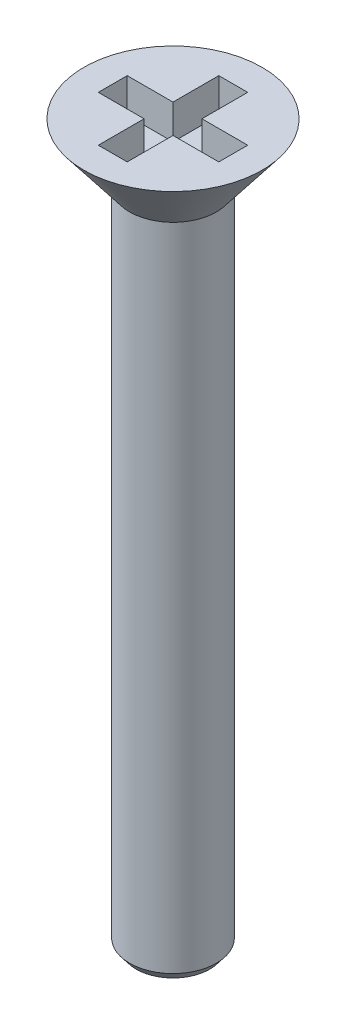
ISO-10303-21;
HEADER;
FILE_DESCRIPTION(('STEP AP214'),'2;1');
FILE_NAME('part.step','',(''),(''),'','','');
FILE_SCHEMA(('AUTOMOTIVE_DESIGN { 1 0 10303 214 1 1 1 1 }'));
ENDSEC;
DATA;
#1=APPLICATION_CONTEXT('core data for automotive mechanical design processes');
#2=APPLICATION_PROTOCOL_DEFINITION('international standard','automotive_design',2000,#1);
#3=PRODUCT_CONTEXT('',#1,'mechanical');
#4=PRODUCT('Part','Part','',(#3));
#5=PRODUCT_RELATED_PRODUCT_CATEGORY('part','',(#4));
#6=PRODUCT_DEFINITION_FORMATION('','',#4);
#7=PRODUCT_DEFINITION_CONTEXT('part definition',#1,'design');
#8=PRODUCT_DEFINITION('design','',#6,#7);
#9=PRODUCT_DEFINITION_SHAPE('','',#8);
#10=(LENGTH_UNIT() NAMED_UNIT(*) SI_UNIT(.MILLI.,.METRE.));
#11=(NAMED_UNIT(*) PLANE_ANGLE_UNIT() SI_UNIT($,.RADIAN.));
#12=(NAMED_UNIT(*) SI_UNIT($,.STERADIAN.) SOLID_ANGLE_UNIT());
#13=UNCERTAINTY_MEASURE_WITH_UNIT(LENGTH_MEASURE(1.E-05),#10,'distance_accuracy_value','');
#14=(GEOMETRIC_REPRESENTATION_CONTEXT(3) GLOBAL_UNCERTAINTY_ASSIGNED_CONTEXT((#13)) GLOBAL_UNIT_ASSIGNED_CONTEXT((#10,
#11,#12)) REPRESENTATION_CONTEXT('',''));
#15=CARTESIAN_POINT('',(0.,0.,0.));
#16=DIRECTION('',(0.,0.,1.));
#17=DIRECTION('',(1.,0.,0.));
#18=AXIS2_PLACEMENT_3D('',#15,#16,#17);
#19=CARTESIAN_POINT('',(0.,11.7896796485183,0.));
#20=DIRECTION('',(0.,1.,0.));
#21=DIRECTION('',(0.,0.,1.));
#22=AXIS2_PLACEMENT_3D('',#19,#20,#21);
#23=PLANE('',#22);
#24=CARTESIAN_POINT('',(0.,11.7896796485183,0.));
#25=DIRECTION('',(0.,1.,0.));
#26=DIRECTION('',(0.,0.,1.));
#27=AXIS2_PLACEMENT_3D('',#24,#25,#26);
#28=CIRCLE('',#27,3.7);
#29=CARTESIAN_POINT('',(0.,11.7896796485183,3.7));
#30=VERTEX_POINT('',#29);
#31=EDGE_CURVE('E11',#30,#30,#28,.T.);
#32=ORIENTED_EDGE('',*,*,#31,.T.);
#33=EDGE_LOOP('',(#32));
#34=FACE_BOUND('',#33,.T.);
#35=DIRECTION('',(0.,0.,-1.));
#36=VECTOR('',#35,1.);
#37=CARTESIAN_POINT('',(2.5,11.7896796485183,0.));
#38=LINE('',#37,#36);
#39=CARTESIAN_POINT('',(2.5,11.7896796485183,0.600000000000009));
#40=VERTEX_POINT('',#39);
#41=CARTESIAN_POINT('',(2.5,11.7896796485183,-0.599999999999991));
#42=VERTEX_POINT('',#41);
#43=EDGE_CURVE('E156',#40,#42,#38,.T.);
#44=ORIENTED_EDGE('',*,*,#43,.F.);
#45=DIRECTION('',(-1.,0.,0.));
#46=VECTOR('',#45,1.);
#47=CARTESIAN_POINT('',(0.,11.7896796485183,0.6));
#48=LINE('',#47,#46);
#49=CARTESIAN_POINT('',(0.6,11.7896796485183,0.600000000000006));
#50=VERTEX_POINT('',#49);
#51=EDGE_CURVE('E47',#40,#50,#48,.T.);
#52=ORIENTED_EDGE('',*,*,#51,.T.);
#53=DIRECTION('',(0.,0.,-1.));
#54=VECTOR('',#53,1.);
#55=CARTESIAN_POINT('',(0.6,11.7896796485183,0.));
#56=LINE('',#55,#54);
#57=CARTESIAN_POINT('',(0.6,11.7896796485183,2.5));
#58=VERTEX_POINT('',#57);
#59=EDGE_CURVE('E183',#58,#50,#56,.T.);
#60=ORIENTED_EDGE('',*,*,#59,.F.);
#61=DIRECTION('',(-1.,0.,0.));
#62=VECTOR('',#61,1.);
#63=CARTESIAN_POINT('',(0.,11.7896796485183,2.5));
#64=LINE('',#63,#62);
#65=CARTESIAN_POINT('',(-0.6,11.7896796485183,2.5));
#66=VERTEX_POINT('',#65);
#67=EDGE_CURVE('E181',#58,#66,#64,.T.);
#68=ORIENTED_EDGE('',*,*,#67,.T.);
#69=DIRECTION('',(0.,0.,-1.));
#70=VECTOR('',#69,1.);
#71=CARTESIAN_POINT('',(-0.600000000000005,11.7896796485183,0.));
#72=LINE('',#71,#70);
#73=CARTESIAN_POINT('',(-0.600000000000004,11.7896796485183,0.599999999999998));
#74=VERTEX_POINT('',#73);
#75=EDGE_CURVE('E140',#66,#74,#72,.T.);
#76=ORIENTED_EDGE('',*,*,#75,.T.);
#77=DIRECTION('',(1.,0.,0.));
#78=VECTOR('',#77,1.);
#79=CARTESIAN_POINT('',(0.,11.7896796485183,0.6));
#80=LINE('',#79,#78);
#81=CARTESIAN_POINT('',(-2.5,11.7896796485183,0.599999999999991));
#82=VERTEX_POINT('',#81);
#83=EDGE_CURVE('E177',#82,#74,#80,.T.);
#84=ORIENTED_EDGE('',*,*,#83,.F.);
#85=DIRECTION('',(0.,0.,-1.));
#86=VECTOR('',#85,1.);
#87=CARTESIAN_POINT('',(-2.5,11.7896796485183,0.));
#88=LINE('',#87,#86);
#89=CARTESIAN_POINT('',(-2.5,11.7896796485183,-0.600000000000009));
#90=VERTEX_POINT('',#89);
#91=EDGE_CURVE('E174',#82,#90,#88,.T.);
#92=ORIENTED_EDGE('',*,*,#91,.T.);
#93=DIRECTION('',(1.,0.,0.));
#94=VECTOR('',#93,1.);
#95=CARTESIAN_POINT('',(0.,11.7896796485183,-0.600000000000006));
#96=LINE('',#95,#94);
#97=CARTESIAN_POINT('',(-0.6,11.7896796485183,-0.600000000000006));
#98=VERTEX_POINT('',#97);
#99=EDGE_CURVE('E171',#90,#98,#96,.T.);
#100=ORIENTED_EDGE('',*,*,#99,.T.);
#101=DIRECTION('',(0.,0.,1.));
#102=VECTOR('',#101,1.);
#103=CARTESIAN_POINT('',(-0.600000000000006,11.7896796485183,0.));
#104=LINE('',#103,#102);
#105=CARTESIAN_POINT('',(-0.6,11.7896796485183,-2.5));
#106=VERTEX_POINT('',#105);
#107=EDGE_CURVE('E168',#106,#98,#104,.T.);
#108=ORIENTED_EDGE('',*,*,#107,.F.);
#109=DIRECTION('',(-1.,0.,0.));
#110=VECTOR('',#109,1.);
#111=CARTESIAN_POINT('',(0.,11.7896796485183,-2.5));
#112=LINE('',#111,#110);
#113=CARTESIAN_POINT('',(0.6,11.7896796485183,-2.5));
#114=VERTEX_POINT('',#113);
#115=EDGE_CURVE('E165',#114,#106,#112,.T.);
#116=ORIENTED_EDGE('',*,*,#115,.F.);
#117=DIRECTION('',(0.,0.,1.));
#118=VECTOR('',#117,1.);
#119=CARTESIAN_POINT('',(0.6,11.7896796485183,0.));
#120=LINE('',#119,#118);
#121=CARTESIAN_POINT('',(0.600000000000004,11.7896796485183,-0.599999999999998));
#122=VERTEX_POINT('',#121);
#123=EDGE_CURVE('E162',#114,#122,#120,.T.);
#124=ORIENTED_EDGE('',*,*,#123,.T.);
#125=DIRECTION('',(-1.,0.,0.));
#126=VECTOR('',#125,1.);
#127=CARTESIAN_POINT('',(0.,11.7896796485183,-0.600000000000006));
#128=LINE('',#127,#126);
#129=EDGE_CURVE('E159',#42,#122,#128,.T.);
#130=ORIENTED_EDGE('',*,*,#129,.F.);
#131=EDGE_LOOP('',(#44,#52,#60,#68,#76,#84,#92,#100,#108,#116,#124,#130));
#132=FACE_BOUND('',#131,.T.);
#133=ADVANCED_FACE('F33',(#34,#132),#23,.T.);
#134=CARTESIAN_POINT('',(0.,11.7896796485183,0.));
#135=DIRECTION('',(0.,1.,0.));
#136=DIRECTION('',(0.,0.,1.));
#137=AXIS2_PLACEMENT_3D('',#134,#135,#136);
#138=CONICAL_SURFACE('',#137,3.7,0.659628742636921);
#139=CARTESIAN_POINT('',(0.,9.33967964851831,0.));
#140=DIRECTION('',(0.,1.,0.));
#141=DIRECTION('',(0.,0.,1.));
#142=AXIS2_PLACEMENT_3D('',#139,#140,#141);
#143=CIRCLE('',#142,1.8);
#144=CARTESIAN_POINT('',(0.,9.33967964851831,1.8));
#145=VERTEX_POINT('',#144);
#146=EDGE_CURVE('E40',#145,#145,#143,.T.);
#147=ORIENTED_EDGE('',*,*,#146,.T.);
#148=EDGE_LOOP('',(#147));
#149=FACE_BOUND('',#148,.T.);
#150=ORIENTED_EDGE('',*,*,#31,.F.);
#151=EDGE_LOOP('',(#150));
#152=FACE_BOUND('',#151,.T.);
#153=ADVANCED_FACE('F211',(#149,#152),#138,.T.);
#154=CARTESIAN_POINT('',(0.,14.4405151022248,0.));
#155=DIRECTION('',(0.,1.,0.));
#156=DIRECTION('',(0.,0.,1.));
#157=AXIS2_PLACEMENT_3D('',#154,#155,#156);
#158=CYLINDRICAL_SURFACE('',#157,1.8);
#159=CARTESIAN_POINT('',(0.,-17.6603203514817,0.));
#160=DIRECTION('',(0.,1.,0.));
#161=DIRECTION('',(0.,0.,1.));
#162=AXIS2_PLACEMENT_3D('',#159,#160,#161);
#163=CIRCLE('',#162,1.8);
#164=CARTESIAN_POINT('',(0.,-17.6603203514817,1.8));
#165=VERTEX_POINT('',#164);
#166=EDGE_CURVE('E206',#165,#165,#163,.T.);
#167=ORIENTED_EDGE('',*,*,#166,.T.);
#168=EDGE_LOOP('',(#167));
#169=FACE_BOUND('',#168,.T.);
#170=ORIENTED_EDGE('',*,*,#146,.F.);
#171=EDGE_LOOP('',(#170));
#172=FACE_BOUND('',#171,.T.);
#173=ADVANCED_FACE('F214',(#169,#172),#158,.T.);
#174=CARTESIAN_POINT('',(0.,-17.6603203514817,0.));
#175=DIRECTION('',(0.,1.,0.));
#176=DIRECTION('',(0.,0.,1.));
#177=AXIS2_PLACEMENT_3D('',#174,#175,#176);
#178=CONICAL_SURFACE('',#177,1.8,0.65962874263692);
#179=CARTESIAN_POINT('',(0.,-18.0103203514817,0.));
#180=DIRECTION('',(0.,1.,0.));
#181=DIRECTION('',(0.,0.,1.));
#182=AXIS2_PLACEMENT_3D('',#179,#180,#181);
#183=CIRCLE('',#182,1.52857142857142);
#184=CARTESIAN_POINT('',(0.,-18.0103203514817,1.52857142857142));
#185=VERTEX_POINT('',#184);
#186=EDGE_CURVE('E186',#185,#185,#183,.T.);
#187=ORIENTED_EDGE('',*,*,#186,.T.);
#188=EDGE_LOOP('',(#187));
#189=FACE_BOUND('',#188,.T.);
#190=ORIENTED_EDGE('',*,*,#166,.F.);
#191=EDGE_LOOP('',(#190));
#192=FACE_BOUND('',#191,.T.);
#193=ADVANCED_FACE('F216',(#189,#192),#178,.T.);
#194=CARTESIAN_POINT('',(0.,-18.0103203514817,1.52857142857142));
#195=DIRECTION('',(0.,-1.,0.));
#196=DIRECTION('',(0.,0.,-1.));
#197=AXIS2_PLACEMENT_3D('',#194,#195,#196);
#198=PLANE('',#197);
#199=ORIENTED_EDGE('',*,*,#186,.F.);
#200=EDGE_LOOP('',(#199));
#201=FACE_BOUND('',#200,.T.);
#202=ADVANCED_FACE('F223',(#201),#198,.T.);
#203=CARTESIAN_POINT('',(0.,10.3596796485183,0.6));
#204=DIRECTION('',(0.,0.,-1.));
#205=DIRECTION('',(-1.,0.,0.));
#206=AXIS2_PLACEMENT_3D('',#203,#204,#205);
#207=PLANE('',#206);
#208=ORIENTED_EDGE('',*,*,#51,.F.);
#209=DIRECTION('',(0.,1.,0.));
#210=VECTOR('',#209,1.);
#211=CARTESIAN_POINT('',(2.5,10.3596796485183,0.600000000000009));
#212=LINE('',#211,#210);
#213=CARTESIAN_POINT('',(2.5,10.3596796485183,0.600000000000009));
#214=VERTEX_POINT('',#213);
#215=EDGE_CURVE('E95',#214,#40,#212,.T.);
#216=ORIENTED_EDGE('',*,*,#215,.F.);
#217=DIRECTION('',(-1.,0.,0.));
#218=VECTOR('',#217,1.);
#219=CARTESIAN_POINT('',(0.,10.3596796485183,0.6));
#220=LINE('',#219,#218);
#221=CARTESIAN_POINT('',(0.6,10.3596796485183,0.600000000000006));
#222=VERTEX_POINT('',#221);
#223=EDGE_CURVE('E53',#214,#222,#220,.T.);
#224=ORIENTED_EDGE('',*,*,#223,.T.);
#225=DIRECTION('',(0.,1.,0.));
#226=VECTOR('',#225,1.);
#227=CARTESIAN_POINT('',(0.6,10.3596796485183,0.600000000000006));
#228=LINE('',#227,#226);
#229=EDGE_CURVE('E91',#222,#50,#228,.T.);
#230=ORIENTED_EDGE('',*,*,#229,.T.);
#231=EDGE_LOOP('',(#208,#216,#224,#230));
#232=FACE_BOUND('',#231,.T.);
#233=ADVANCED_FACE('F303',(#232),#207,.T.);
#234=CARTESIAN_POINT('',(0.6,10.3596796485183,0.));
#235=DIRECTION('',(1.,0.,0.));
#236=DIRECTION('',(0.,0.,-1.));
#237=AXIS2_PLACEMENT_3D('',#234,#235,#236);
#238=PLANE('',#237);
#239=ORIENTED_EDGE('',*,*,#59,.T.);
#240=ORIENTED_EDGE('',*,*,#229,.F.);
#241=DIRECTION('',(0.,0.,-1.));
#242=VECTOR('',#241,1.);
#243=CARTESIAN_POINT('',(0.6,10.3596796485183,0.));
#244=LINE('',#243,#242);
#245=CARTESIAN_POINT('',(0.6,10.3596796485183,2.5));
#246=VERTEX_POINT('',#245);
#247=EDGE_CURVE('E133',#246,#222,#244,.T.);
#248=ORIENTED_EDGE('',*,*,#247,.F.);
#249=DIRECTION('',(0.,1.,0.));
#250=VECTOR('',#249,1.);
#251=CARTESIAN_POINT('',(0.6,10.3596796485183,2.5));
#252=LINE('',#251,#250);
#253=EDGE_CURVE('E128',#246,#58,#252,.T.);
#254=ORIENTED_EDGE('',*,*,#253,.T.);
#255=EDGE_LOOP('',(#239,#240,#248,#254));
#256=FACE_BOUND('',#255,.T.);
#257=ADVANCED_FACE('F306',(#256),#238,.F.);
#258=CARTESIAN_POINT('',(0.,10.3596796485183,2.5));
#259=DIRECTION('',(0.,0.,-1.));
#260=DIRECTION('',(-1.,0.,0.));
#261=AXIS2_PLACEMENT_3D('',#258,#259,#260);
#262=PLANE('',#261);
#263=ORIENTED_EDGE('',*,*,#67,.F.);
#264=ORIENTED_EDGE('',*,*,#253,.F.);
#265=DIRECTION('',(-1.,0.,0.));
#266=VECTOR('',#265,1.);
#267=CARTESIAN_POINT('',(0.,10.3596796485183,2.5));
#268=LINE('',#267,#266);
#269=CARTESIAN_POINT('',(-0.6,10.3596796485183,2.5));
#270=VERTEX_POINT('',#269);
#271=EDGE_CURVE('E122',#246,#270,#268,.T.);
#272=ORIENTED_EDGE('',*,*,#271,.T.);
#273=DIRECTION('',(0.,1.,0.));
#274=VECTOR('',#273,1.);
#275=CARTESIAN_POINT('',(-0.6,10.3596796485183,2.5));
#276=LINE('',#275,#274);
#277=EDGE_CURVE('E126',#270,#66,#276,.T.);
#278=ORIENTED_EDGE('',*,*,#277,.T.);
#279=EDGE_LOOP('',(#263,#264,#272,#278));
#280=FACE_BOUND('',#279,.T.);
#281=ADVANCED_FACE('F125',(#280),#262,.T.);
#282=CARTESIAN_POINT('',(-0.600000000000005,10.3596796485183,0.));
#283=DIRECTION('',(1.,0.,0.));
#284=DIRECTION('',(0.,0.,-1.));
#285=AXIS2_PLACEMENT_3D('',#282,#283,#284);
#286=PLANE('',#285);
#287=ORIENTED_EDGE('',*,*,#75,.F.);
#288=ORIENTED_EDGE('',*,*,#277,.F.);
#289=DIRECTION('',(0.,0.,-1.));
#290=VECTOR('',#289,1.);
#291=CARTESIAN_POINT('',(-0.600000000000005,10.3596796485183,0.));
#292=LINE('',#291,#290);
#293=CARTESIAN_POINT('',(-0.600000000000004,10.3596796485183,0.599999999999998));
#294=VERTEX_POINT('',#293);
#295=EDGE_CURVE('E134',#270,#294,#292,.T.);
#296=ORIENTED_EDGE('',*,*,#295,.T.);
#297=DIRECTION('',(0.,1.,0.));
#298=VECTOR('',#297,1.);
#299=CARTESIAN_POINT('',(-0.600000000000004,10.3596796485183,0.599999999999998));
#300=LINE('',#299,#298);
#301=EDGE_CURVE('E142',#294,#74,#300,.T.);
#302=ORIENTED_EDGE('',*,*,#301,.T.);
#303=EDGE_LOOP('',(#287,#288,#296,#302));
#304=FACE_BOUND('',#303,.T.);
#305=ADVANCED_FACE('F137',(#304),#286,.T.);
#306=CARTESIAN_POINT('',(0.,10.3596796485183,0.6));
#307=DIRECTION('',(0.,0.,1.));
#308=DIRECTION('',(1.,0.,0.));
#309=AXIS2_PLACEMENT_3D('',#306,#307,#308);
#310=PLANE('',#309);
#311=ORIENTED_EDGE('',*,*,#83,.T.);
#312=ORIENTED_EDGE('',*,*,#301,.F.);
#313=DIRECTION('',(1.,0.,0.));
#314=VECTOR('',#313,1.);
#315=CARTESIAN_POINT('',(0.,10.3596796485183,0.6));
#316=LINE('',#315,#314);
#317=CARTESIAN_POINT('',(-2.5,10.3596796485183,0.599999999999991));
#318=VERTEX_POINT('',#317);
#319=EDGE_CURVE('E148',#318,#294,#316,.T.);
#320=ORIENTED_EDGE('',*,*,#319,.F.);
#321=DIRECTION('',(0.,1.,0.));
#322=VECTOR('',#321,1.);
#323=CARTESIAN_POINT('',(-2.5,10.3596796485183,0.599999999999991));
#324=LINE('',#323,#322);
#325=EDGE_CURVE('E189',#318,#82,#324,.T.);
#326=ORIENTED_EDGE('',*,*,#325,.T.);
#327=EDGE_LOOP('',(#311,#312,#320,#326));
#328=FACE_BOUND('',#327,.T.);
#329=ADVANCED_FACE('F274',(#328),#310,.F.);
#330=CARTESIAN_POINT('',(-2.5,10.3596796485183,0.));
#331=DIRECTION('',(1.,0.,0.));
#332=DIRECTION('',(0.,0.,-1.));
#333=AXIS2_PLACEMENT_3D('',#330,#331,#332);
#334=PLANE('',#333);
#335=ORIENTED_EDGE('',*,*,#91,.F.);
#336=ORIENTED_EDGE('',*,*,#325,.F.);
#337=DIRECTION('',(0.,0.,-1.));
#338=VECTOR('',#337,1.);
#339=CARTESIAN_POINT('',(-2.5,10.3596796485183,0.));
#340=LINE('',#339,#338);
#341=CARTESIAN_POINT('',(-2.5,10.3596796485183,-0.600000000000009));
#342=VERTEX_POINT('',#341);
#343=EDGE_CURVE('E150',#318,#342,#340,.T.);
#344=ORIENTED_EDGE('',*,*,#343,.T.);
#345=DIRECTION('',(0.,1.,0.));
#346=VECTOR('',#345,1.);
#347=CARTESIAN_POINT('',(-2.5,10.3596796485183,-0.600000000000009));
#348=LINE('',#347,#346);
#349=EDGE_CURVE('E191',#342,#90,#348,.T.);
#350=ORIENTED_EDGE('',*,*,#349,.T.);
#351=EDGE_LOOP('',(#335,#336,#344,#350));
#352=FACE_BOUND('',#351,.T.);
#353=ADVANCED_FACE('F259',(#352),#334,.T.);
#354=CARTESIAN_POINT('',(0.,10.3596796485183,-0.600000000000006));
#355=DIRECTION('',(0.,0.,1.));
#356=DIRECTION('',(1.,0.,0.));
#357=AXIS2_PLACEMENT_3D('',#354,#355,#356);
#358=PLANE('',#357);
#359=ORIENTED_EDGE('',*,*,#99,.F.);
#360=ORIENTED_EDGE('',*,*,#349,.F.);
#361=DIRECTION('',(1.,0.,0.));
#362=VECTOR('',#361,1.);
#363=CARTESIAN_POINT('',(0.,10.3596796485183,-0.600000000000006));
#364=LINE('',#363,#362);
#365=CARTESIAN_POINT('',(-0.6,10.3596796485183,-0.600000000000006));
#366=VERTEX_POINT('',#365);
#367=EDGE_CURVE('E255',#342,#366,#364,.T.);
#368=ORIENTED_EDGE('',*,*,#367,.T.);
#369=DIRECTION('',(0.,1.,0.));
#370=VECTOR('',#369,1.);
#371=CARTESIAN_POINT('',(-0.6,10.3596796485183,-0.600000000000006));
#372=LINE('',#371,#370);
#373=EDGE_CURVE('E193',#366,#98,#372,.T.);
#374=ORIENTED_EDGE('',*,*,#373,.T.);
#375=EDGE_LOOP('',(#359,#360,#368,#374));
#376=FACE_BOUND('',#375,.T.);
#377=ADVANCED_FACE('F263',(#376),#358,.T.);
#378=CARTESIAN_POINT('',(-0.600000000000006,10.3596796485183,0.));
#379=DIRECTION('',(-1.,0.,0.));
#380=DIRECTION('',(0.,0.,1.));
#381=AXIS2_PLACEMENT_3D('',#378,#379,#380);
#382=PLANE('',#381);
#383=ORIENTED_EDGE('',*,*,#107,.T.);
#384=ORIENTED_EDGE('',*,*,#373,.F.);
#385=DIRECTION('',(0.,0.,1.));
#386=VECTOR('',#385,1.);
#387=CARTESIAN_POINT('',(-0.600000000000006,10.3596796485183,0.));
#388=LINE('',#387,#386);
#389=CARTESIAN_POINT('',(-0.6,10.3596796485183,-2.5));
#390=VERTEX_POINT('',#389);
#391=EDGE_CURVE('E252',#390,#366,#388,.T.);
#392=ORIENTED_EDGE('',*,*,#391,.F.);
#393=DIRECTION('',(0.,1.,0.));
#394=VECTOR('',#393,1.);
#395=CARTESIAN_POINT('',(-0.6,10.3596796485183,-2.5));
#396=LINE('',#395,#394);
#397=EDGE_CURVE('E195',#390,#106,#396,.T.);
#398=ORIENTED_EDGE('',*,*,#397,.T.);
#399=EDGE_LOOP('',(#383,#384,#392,#398));
#400=FACE_BOUND('',#399,.T.);
#401=ADVANCED_FACE('F269',(#400),#382,.F.);
#402=CARTESIAN_POINT('',(0.,10.3596796485183,-2.5));
#403=DIRECTION('',(0.,0.,-1.));
#404=DIRECTION('',(-1.,0.,0.));
#405=AXIS2_PLACEMENT_3D('',#402,#403,#404);
#406=PLANE('',#405);
#407=ORIENTED_EDGE('',*,*,#115,.T.);
#408=ORIENTED_EDGE('',*,*,#397,.F.);
#409=DIRECTION('',(-1.,0.,0.));
#410=VECTOR('',#409,1.);
#411=CARTESIAN_POINT('',(0.,10.3596796485183,-2.5));
#412=LINE('',#411,#410);
#413=CARTESIAN_POINT('',(0.6,10.3596796485183,-2.5));
#414=VERTEX_POINT('',#413);
#415=EDGE_CURVE('E249',#414,#390,#412,.T.);
#416=ORIENTED_EDGE('',*,*,#415,.F.);
#417=DIRECTION('',(0.,1.,0.));
#418=VECTOR('',#417,1.);
#419=CARTESIAN_POINT('',(0.6,10.3596796485183,-2.5));
#420=LINE('',#419,#418);
#421=EDGE_CURVE('E197',#414,#114,#420,.T.);
#422=ORIENTED_EDGE('',*,*,#421,.T.);
#423=EDGE_LOOP('',(#407,#408,#416,#422));
#424=FACE_BOUND('',#423,.T.);
#425=ADVANCED_FACE('F289',(#424),#406,.F.);
#426=CARTESIAN_POINT('',(0.6,10.3596796485183,0.));
#427=DIRECTION('',(-1.,0.,0.));
#428=DIRECTION('',(0.,0.,1.));
#429=AXIS2_PLACEMENT_3D('',#426,#427,#428);
#430=PLANE('',#429);
#431=ORIENTED_EDGE('',*,*,#123,.F.);
#432=ORIENTED_EDGE('',*,*,#421,.F.);
#433=DIRECTION('',(0.,0.,1.));
#434=VECTOR('',#433,1.);
#435=CARTESIAN_POINT('',(0.6,10.3596796485183,0.));
#436=LINE('',#435,#434);
#437=CARTESIAN_POINT('',(0.600000000000004,10.3596796485183,-0.599999999999998));
#438=VERTEX_POINT('',#437);
#439=EDGE_CURVE('E244',#414,#438,#436,.T.);
#440=ORIENTED_EDGE('',*,*,#439,.T.);
#441=DIRECTION('',(0.,1.,0.));
#442=VECTOR('',#441,1.);
#443=CARTESIAN_POINT('',(0.600000000000004,10.3596796485183,-0.599999999999998));
#444=LINE('',#443,#442);
#445=EDGE_CURVE('E199',#438,#122,#444,.T.);
#446=ORIENTED_EDGE('',*,*,#445,.T.);
#447=EDGE_LOOP('',(#431,#432,#440,#446));
#448=FACE_BOUND('',#447,.T.);
#449=ADVANCED_FACE('F292',(#448),#430,.T.);
#450=CARTESIAN_POINT('',(0.,10.3596796485183,-0.600000000000006));
#451=DIRECTION('',(0.,0.,-1.));
#452=DIRECTION('',(-1.,0.,0.));
#453=AXIS2_PLACEMENT_3D('',#450,#451,#452);
#454=PLANE('',#453);
#455=ORIENTED_EDGE('',*,*,#129,.T.);
#456=ORIENTED_EDGE('',*,*,#445,.F.);
#457=DIRECTION('',(-1.,0.,0.));
#458=VECTOR('',#457,1.);
#459=CARTESIAN_POINT('',(0.,10.3596796485183,-0.600000000000006));
#460=LINE('',#459,#458);
#461=CARTESIAN_POINT('',(2.5,10.3596796485183,-0.599999999999991));
#462=VERTEX_POINT('',#461);
#463=EDGE_CURVE('E242',#462,#438,#460,.T.);
#464=ORIENTED_EDGE('',*,*,#463,.F.);
#465=DIRECTION('',(0.,1.,0.));
#466=VECTOR('',#465,1.);
#467=CARTESIAN_POINT('',(2.5,10.3596796485183,-0.599999999999991));
#468=LINE('',#467,#466);
#469=EDGE_CURVE('E201',#462,#42,#468,.T.);
#470=ORIENTED_EDGE('',*,*,#469,.T.);
#471=EDGE_LOOP('',(#455,#456,#464,#470));
#472=FACE_BOUND('',#471,.T.);
#473=ADVANCED_FACE('F296',(#472),#454,.F.);
#474=CARTESIAN_POINT('',(2.5,10.3596796485183,0.));
#475=DIRECTION('',(1.,0.,0.));
#476=DIRECTION('',(0.,0.,-1.));
#477=AXIS2_PLACEMENT_3D('',#474,#475,#476);
#478=PLANE('',#477);
#479=ORIENTED_EDGE('',*,*,#43,.T.);
#480=ORIENTED_EDGE('',*,*,#469,.F.);
#481=DIRECTION('',(0.,0.,-1.));
#482=VECTOR('',#481,1.);
#483=CARTESIAN_POINT('',(2.5,10.3596796485183,0.));
#484=LINE('',#483,#482);
#485=EDGE_CURVE('E240',#214,#462,#484,.T.);
#486=ORIENTED_EDGE('',*,*,#485,.F.);
#487=ORIENTED_EDGE('',*,*,#215,.T.);
#488=EDGE_LOOP('',(#479,#480,#486,#487));
#489=FACE_BOUND('',#488,.T.);
#490=ADVANCED_FACE('F236',(#489),#478,.F.);
#491=CARTESIAN_POINT('',(0.,10.3596796485183,0.));
#492=DIRECTION('',(0.,1.,0.));
#493=DIRECTION('',(0.,0.,1.));
#494=AXIS2_PLACEMENT_3D('',#491,#492,#493);
#495=PLANE('',#494);
#496=ORIENTED_EDGE('',*,*,#223,.F.);
#497=ORIENTED_EDGE('',*,*,#485,.T.);
#498=ORIENTED_EDGE('',*,*,#463,.T.);
#499=ORIENTED_EDGE('',*,*,#439,.F.);
#500=ORIENTED_EDGE('',*,*,#415,.T.);
#501=ORIENTED_EDGE('',*,*,#391,.T.);
#502=ORIENTED_EDGE('',*,*,#367,.F.);
#503=ORIENTED_EDGE('',*,*,#343,.F.);
#504=ORIENTED_EDGE('',*,*,#319,.T.);
#505=ORIENTED_EDGE('',*,*,#295,.F.);
#506=ORIENTED_EDGE('',*,*,#271,.F.);
#507=ORIENTED_EDGE('',*,*,#247,.T.);
#508=EDGE_LOOP('',(#496,#497,#498,#499,#500,#501,#502,#503,#504,#505,#506,#507));
#509=FACE_BOUND('',#508,.T.);
#510=ADVANCED_FACE('F145',(#509),#495,.T.);
#511=CLOSED_SHELL('',(#133,#153,#173,#193,#202,#233,#257,#281,#305,#329,#353,#377,#401,#425,
#449,#473,#490,#510));
#512=MANIFOLD_SOLID_BREP('B2',#511);
#513=ADVANCED_BREP_SHAPE_REPRESENTATION('',(#18,#512),#14);
#514=SHAPE_DEFINITION_REPRESENTATION(#9,#513);
ENDSEC;
END-ISO-10303-21;
